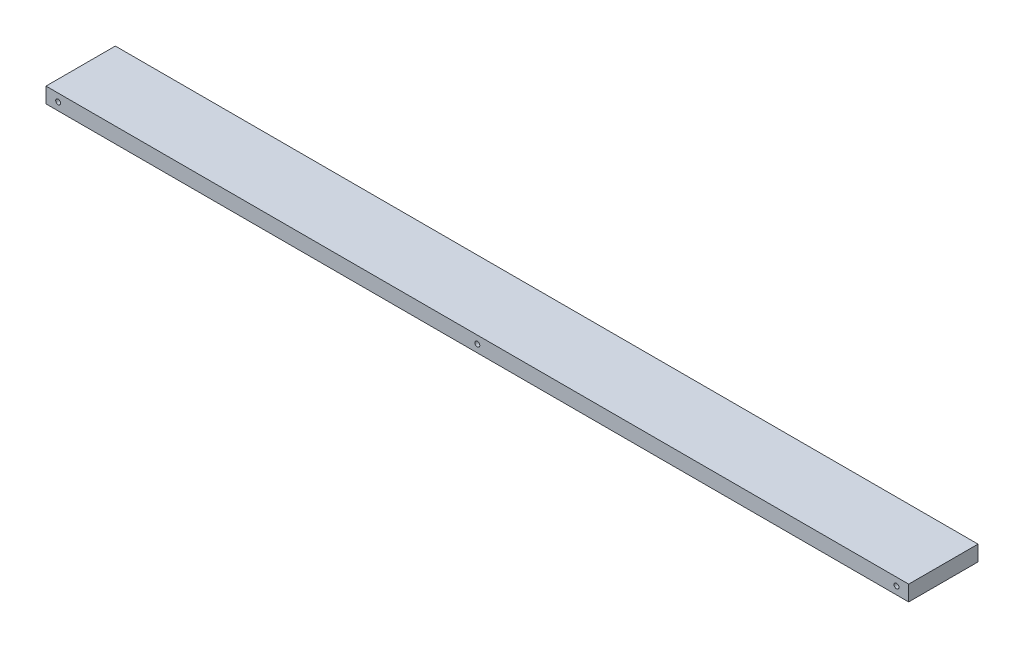
ISO-10303-21;
HEADER;
FILE_DESCRIPTION(('STEP AP214'),'2;1');
FILE_NAME('part.step','',(''),(''),'','','');
FILE_SCHEMA(('AUTOMOTIVE_DESIGN { 1 0 10303 214 1 1 1 1 }'));
ENDSEC;
DATA;
#1=APPLICATION_CONTEXT('core data for automotive mechanical design processes');
#2=APPLICATION_PROTOCOL_DEFINITION('international standard','automotive_design',2000,#1);
#3=PRODUCT_CONTEXT('',#1,'mechanical');
#4=PRODUCT('Part','Part','',(#3));
#5=PRODUCT_RELATED_PRODUCT_CATEGORY('part','',(#4));
#6=PRODUCT_DEFINITION_FORMATION('','',#4);
#7=PRODUCT_DEFINITION_CONTEXT('part definition',#1,'design');
#8=PRODUCT_DEFINITION('design','',#6,#7);
#9=PRODUCT_DEFINITION_SHAPE('','',#8);
#10=(LENGTH_UNIT() NAMED_UNIT(*) SI_UNIT(.MILLI.,.METRE.));
#11=(NAMED_UNIT(*) PLANE_ANGLE_UNIT() SI_UNIT($,.RADIAN.));
#12=(NAMED_UNIT(*) SI_UNIT($,.STERADIAN.) SOLID_ANGLE_UNIT());
#13=UNCERTAINTY_MEASURE_WITH_UNIT(LENGTH_MEASURE(1.E-05),#10,'distance_accuracy_value','');
#14=(GEOMETRIC_REPRESENTATION_CONTEXT(3) GLOBAL_UNCERTAINTY_ASSIGNED_CONTEXT((#13)) GLOBAL_UNIT_ASSIGNED_CONTEXT((#10,
#11,#12)) REPRESENTATION_CONTEXT('',''));
#15=CARTESIAN_POINT('',(0.,0.,0.));
#16=DIRECTION('',(0.,0.,1.));
#17=DIRECTION('',(1.,0.,0.));
#18=AXIS2_PLACEMENT_3D('',#15,#16,#17);
#19=CARTESIAN_POINT('',(0.,12.7,0.));
#20=DIRECTION('',(1.,0.,0.));
#21=DIRECTION('',(0.,0.,-1.));
#22=AXIS2_PLACEMENT_3D('',#19,#20,#21);
#23=PLANE('',#22);
#24=DIRECTION('',(0.,0.,1.));
#25=VECTOR('',#24,1.);
#26=CARTESIAN_POINT('',(0.,0.,0.));
#27=LINE('',#26,#25);
#28=CARTESIAN_POINT('',(0.,0.,-56.98));
#29=VERTEX_POINT('',#28);
#30=CARTESIAN_POINT('',(0.,0.,0.));
#31=VERTEX_POINT('',#30);
#32=EDGE_CURVE('E112',#29,#31,#27,.T.);
#33=ORIENTED_EDGE('',*,*,#32,.T.);
#34=DIRECTION('',(0.,-1.,0.));
#35=VECTOR('',#34,1.);
#36=CARTESIAN_POINT('',(0.,12.7,0.));
#37=LINE('',#36,#35);
#38=CARTESIAN_POINT('',(0.,12.7,0.));
#39=VERTEX_POINT('',#38);
#40=EDGE_CURVE('E11',#39,#31,#37,.T.);
#41=ORIENTED_EDGE('',*,*,#40,.F.);
#42=DIRECTION('',(0.,0.,1.));
#43=VECTOR('',#42,1.);
#44=CARTESIAN_POINT('',(0.,12.7,0.));
#45=LINE('',#44,#43);
#46=CARTESIAN_POINT('',(0.,12.7,-56.98));
#47=VERTEX_POINT('',#46);
#48=EDGE_CURVE('E96',#47,#39,#45,.T.);
#49=ORIENTED_EDGE('',*,*,#48,.F.);
#50=DIRECTION('',(0.,-1.,0.));
#51=VECTOR('',#50,1.);
#52=CARTESIAN_POINT('',(0.,12.7,-56.98));
#53=LINE('',#52,#51);
#54=EDGE_CURVE('E108',#47,#29,#53,.T.);
#55=ORIENTED_EDGE('',*,*,#54,.T.);
#56=EDGE_LOOP('',(#33,#41,#49,#55));
#57=FACE_BOUND('',#56,.T.);
#58=ADVANCED_FACE('F44',(#57),#23,.F.);
#59=CARTESIAN_POINT('',(0.,12.7,0.));
#60=DIRECTION('',(0.,0.,-1.));
#61=DIRECTION('',(-1.,0.,0.));
#62=AXIS2_PLACEMENT_3D('',#59,#60,#61);
#63=PLANE('',#62);
#64=CARTESIAN_POINT('',(699.,6.35,0.));
#65=DIRECTION('',(0.,0.,1.));
#66=DIRECTION('',(1.,0.,0.));
#67=AXIS2_PLACEMENT_3D('',#64,#65,#66);
#68=CIRCLE('',#67,2.01949999999992);
#69=CARTESIAN_POINT('',(701.0195,6.35,0.));
#70=VERTEX_POINT('',#69);
#71=EDGE_CURVE('E149',#70,#70,#68,.T.);
#72=ORIENTED_EDGE('',*,*,#71,.F.);
#73=EDGE_LOOP('',(#72));
#74=FACE_BOUND('',#73,.T.);
#75=CARTESIAN_POINT('',(354.5,6.35,0.));
#76=DIRECTION('',(0.,0.,1.));
#77=DIRECTION('',(1.,0.,0.));
#78=AXIS2_PLACEMENT_3D('',#75,#76,#77);
#79=CIRCLE('',#78,2.01950000000003);
#80=CARTESIAN_POINT('',(356.5195,6.35,0.));
#81=VERTEX_POINT('',#80);
#82=EDGE_CURVE('E145',#81,#81,#79,.T.);
#83=ORIENTED_EDGE('',*,*,#82,.F.);
#84=EDGE_LOOP('',(#83));
#85=FACE_BOUND('',#84,.T.);
#86=CARTESIAN_POINT('',(10.,6.35,0.));
#87=DIRECTION('',(0.,0.,1.));
#88=DIRECTION('',(1.,0.,0.));
#89=AXIS2_PLACEMENT_3D('',#86,#87,#88);
#90=CIRCLE('',#89,2.0195);
#91=CARTESIAN_POINT('',(12.0195,6.35,0.));
#92=VERTEX_POINT('',#91);
#93=EDGE_CURVE('E137',#92,#92,#90,.T.);
#94=ORIENTED_EDGE('',*,*,#93,.F.);
#95=EDGE_LOOP('',(#94));
#96=FACE_BOUND('',#95,.T.);
#97=DIRECTION('',(1.,0.,0.));
#98=VECTOR('',#97,1.);
#99=CARTESIAN_POINT('',(0.,0.,0.));
#100=LINE('',#99,#98);
#101=CARTESIAN_POINT('',(709.,0.,0.));
#102=VERTEX_POINT('',#101);
#103=EDGE_CURVE('E101',#31,#102,#100,.T.);
#104=ORIENTED_EDGE('',*,*,#103,.T.);
#105=DIRECTION('',(0.,-1.,0.));
#106=VECTOR('',#105,1.);
#107=CARTESIAN_POINT('',(709.,12.7,0.));
#108=LINE('',#107,#106);
#109=CARTESIAN_POINT('',(709.,12.7,0.));
#110=VERTEX_POINT('',#109);
#111=EDGE_CURVE('E53',#110,#102,#108,.T.);
#112=ORIENTED_EDGE('',*,*,#111,.F.);
#113=DIRECTION('',(1.,0.,0.));
#114=VECTOR('',#113,1.);
#115=CARTESIAN_POINT('',(0.,12.7,0.));
#116=LINE('',#115,#114);
#117=EDGE_CURVE('E91',#39,#110,#116,.T.);
#118=ORIENTED_EDGE('',*,*,#117,.F.);
#119=ORIENTED_EDGE('',*,*,#40,.T.);
#120=EDGE_LOOP('',(#104,#112,#118,#119));
#121=FACE_BOUND('',#120,.T.);
#122=ADVANCED_FACE('F100',(#74,#85,#96,#121),#63,.F.);
#123=CARTESIAN_POINT('',(709.,12.7,0.));
#124=DIRECTION('',(-1.,0.,0.));
#125=DIRECTION('',(0.,0.,1.));
#126=AXIS2_PLACEMENT_3D('',#123,#124,#125);
#127=PLANE('',#126);
#128=DIRECTION('',(0.,0.,-1.));
#129=VECTOR('',#128,1.);
#130=CARTESIAN_POINT('',(709.,0.,0.));
#131=LINE('',#130,#129);
#132=CARTESIAN_POINT('',(709.,0.,-56.98));
#133=VERTEX_POINT('',#132);
#134=EDGE_CURVE('E78',#102,#133,#131,.T.);
#135=ORIENTED_EDGE('',*,*,#134,.T.);
#136=DIRECTION('',(0.,-1.,0.));
#137=VECTOR('',#136,1.);
#138=CARTESIAN_POINT('',(709.,12.7,-56.98));
#139=LINE('',#138,#137);
#140=CARTESIAN_POINT('',(709.,12.7,-56.98));
#141=VERTEX_POINT('',#140);
#142=EDGE_CURVE('E103',#141,#133,#139,.T.);
#143=ORIENTED_EDGE('',*,*,#142,.F.);
#144=DIRECTION('',(0.,0.,-1.));
#145=VECTOR('',#144,1.);
#146=CARTESIAN_POINT('',(709.,12.7,0.));
#147=LINE('',#146,#145);
#148=EDGE_CURVE('E94',#110,#141,#147,.T.);
#149=ORIENTED_EDGE('',*,*,#148,.F.);
#150=ORIENTED_EDGE('',*,*,#111,.T.);
#151=EDGE_LOOP('',(#135,#143,#149,#150));
#152=FACE_BOUND('',#151,.T.);
#153=ADVANCED_FACE('F104',(#152),#127,.F.);
#154=CARTESIAN_POINT('',(0.,12.7,-56.98));
#155=DIRECTION('',(0.,0.,1.));
#156=DIRECTION('',(1.,0.,0.));
#157=AXIS2_PLACEMENT_3D('',#154,#155,#156);
#158=PLANE('',#157);
#159=DIRECTION('',(-1.,0.,0.));
#160=VECTOR('',#159,1.);
#161=CARTESIAN_POINT('',(0.,0.,-56.98));
#162=LINE('',#161,#160);
#163=EDGE_CURVE('E84',#133,#29,#162,.T.);
#164=ORIENTED_EDGE('',*,*,#163,.T.);
#165=ORIENTED_EDGE('',*,*,#54,.F.);
#166=DIRECTION('',(-1.,0.,0.));
#167=VECTOR('',#166,1.);
#168=CARTESIAN_POINT('',(0.,12.7,-56.98));
#169=LINE('',#168,#167);
#170=EDGE_CURVE('E61',#141,#47,#169,.T.);
#171=ORIENTED_EDGE('',*,*,#170,.F.);
#172=ORIENTED_EDGE('',*,*,#142,.T.);
#173=EDGE_LOOP('',(#164,#165,#171,#172));
#174=FACE_BOUND('',#173,.T.);
#175=ADVANCED_FACE('F126',(#174),#158,.F.);
#176=CARTESIAN_POINT('',(0.,12.7,0.));
#177=DIRECTION('',(0.,-1.,0.));
#178=DIRECTION('',(0.,0.,-1.));
#179=AXIS2_PLACEMENT_3D('',#176,#177,#178);
#180=PLANE('',#179);
#181=ORIENTED_EDGE('',*,*,#48,.T.);
#182=ORIENTED_EDGE('',*,*,#117,.T.);
#183=ORIENTED_EDGE('',*,*,#148,.T.);
#184=ORIENTED_EDGE('',*,*,#170,.T.);
#185=EDGE_LOOP('',(#181,#182,#183,#184));
#186=FACE_BOUND('',#185,.T.);
#187=ADVANCED_FACE('F92',(#186),#180,.F.);
#188=CARTESIAN_POINT('',(0.,0.,0.));
#189=DIRECTION('',(0.,-1.,0.));
#190=DIRECTION('',(0.,0.,-1.));
#191=AXIS2_PLACEMENT_3D('',#188,#189,#190);
#192=PLANE('',#191);
#193=ORIENTED_EDGE('',*,*,#32,.F.);
#194=ORIENTED_EDGE('',*,*,#163,.F.);
#195=ORIENTED_EDGE('',*,*,#134,.F.);
#196=ORIENTED_EDGE('',*,*,#103,.F.);
#197=EDGE_LOOP('',(#193,#194,#195,#196));
#198=FACE_BOUND('',#197,.T.);
#199=ADVANCED_FACE('F129',(#198),#192,.T.);
#200=CARTESIAN_POINT('',(10.,6.35,-12.7));
#201=DIRECTION('',(0.,0.,1.));
#202=DIRECTION('',(1.,0.,0.));
#203=AXIS2_PLACEMENT_3D('',#200,#201,#202);
#204=CYLINDRICAL_SURFACE('',#203,2.0195);
#205=CARTESIAN_POINT('',(10.,6.35,-12.7));
#206=DIRECTION('',(0.,0.,1.));
#207=DIRECTION('',(1.,0.,0.));
#208=AXIS2_PLACEMENT_3D('',#205,#206,#207);
#209=CIRCLE('',#208,2.0195);
#210=CARTESIAN_POINT('',(12.0195,6.35,-12.7));
#211=VERTEX_POINT('',#210);
#212=EDGE_CURVE('E133',#211,#211,#209,.T.);
#213=ORIENTED_EDGE('',*,*,#212,.F.);
#214=EDGE_LOOP('',(#213));
#215=FACE_BOUND('',#214,.T.);
#216=ORIENTED_EDGE('',*,*,#93,.T.);
#217=EDGE_LOOP('',(#216));
#218=FACE_BOUND('',#217,.T.);
#219=ADVANCED_FACE('F172',(#215,#218),#204,.F.);
#220=CARTESIAN_POINT('',(10.,6.35,-12.7));
#221=DIRECTION('',(0.,0.,1.));
#222=DIRECTION('',(1.,0.,0.));
#223=AXIS2_PLACEMENT_3D('',#220,#221,#222);
#224=PLANE('',#223);
#225=ORIENTED_EDGE('',*,*,#212,.T.);
#226=EDGE_LOOP('',(#225));
#227=FACE_BOUND('',#226,.T.);
#228=ADVANCED_FACE('F174',(#227),#224,.T.);
#229=CARTESIAN_POINT('',(354.5,6.35,-12.7));
#230=DIRECTION('',(0.,0.,1.));
#231=DIRECTION('',(1.,0.,0.));
#232=AXIS2_PLACEMENT_3D('',#229,#230,#231);
#233=CYLINDRICAL_SURFACE('',#232,2.01950000000003);
#234=CARTESIAN_POINT('',(354.5,6.35,-12.7));
#235=DIRECTION('',(0.,0.,1.));
#236=DIRECTION('',(1.,0.,0.));
#237=AXIS2_PLACEMENT_3D('',#234,#235,#236);
#238=CIRCLE('',#237,2.01950000000003);
#239=CARTESIAN_POINT('',(356.5195,6.35,-12.7));
#240=VERTEX_POINT('',#239);
#241=EDGE_CURVE('E141',#240,#240,#238,.T.);
#242=ORIENTED_EDGE('',*,*,#241,.F.);
#243=EDGE_LOOP('',(#242));
#244=FACE_BOUND('',#243,.T.);
#245=ORIENTED_EDGE('',*,*,#82,.T.);
#246=EDGE_LOOP('',(#245));
#247=FACE_BOUND('',#246,.T.);
#248=ADVANCED_FACE('F180',(#244,#247),#233,.F.);
#249=CARTESIAN_POINT('',(354.5,6.35,-12.7));
#250=DIRECTION('',(0.,0.,1.));
#251=DIRECTION('',(1.,0.,0.));
#252=AXIS2_PLACEMENT_3D('',#249,#250,#251);
#253=PLANE('',#252);
#254=ORIENTED_EDGE('',*,*,#241,.T.);
#255=EDGE_LOOP('',(#254));
#256=FACE_BOUND('',#255,.T.);
#257=ADVANCED_FACE('F162',(#256),#253,.T.);
#258=CARTESIAN_POINT('',(699.,6.35,-12.7));
#259=DIRECTION('',(0.,0.,1.));
#260=DIRECTION('',(1.,0.,0.));
#261=AXIS2_PLACEMENT_3D('',#258,#259,#260);
#262=CYLINDRICAL_SURFACE('',#261,2.01949999999992);
#263=CARTESIAN_POINT('',(699.,6.35,-12.7));
#264=DIRECTION('',(0.,0.,1.));
#265=DIRECTION('',(1.,0.,0.));
#266=AXIS2_PLACEMENT_3D('',#263,#264,#265);
#267=CIRCLE('',#266,2.01949999999992);
#268=CARTESIAN_POINT('',(701.0195,6.35,-12.7));
#269=VERTEX_POINT('',#268);
#270=EDGE_CURVE('E116',#269,#269,#267,.T.);
#271=ORIENTED_EDGE('',*,*,#270,.F.);
#272=EDGE_LOOP('',(#271));
#273=FACE_BOUND('',#272,.T.);
#274=ORIENTED_EDGE('',*,*,#71,.T.);
#275=EDGE_LOOP('',(#274));
#276=FACE_BOUND('',#275,.T.);
#277=ADVANCED_FACE('F159',(#273,#276),#262,.F.);
#278=CARTESIAN_POINT('',(699.,6.35,-12.7));
#279=DIRECTION('',(0.,0.,1.));
#280=DIRECTION('',(1.,0.,0.));
#281=AXIS2_PLACEMENT_3D('',#278,#279,#280);
#282=PLANE('',#281);
#283=ORIENTED_EDGE('',*,*,#270,.T.);
#284=EDGE_LOOP('',(#283));
#285=FACE_BOUND('',#284,.T.);
#286=ADVANCED_FACE('F157',(#285),#282,.T.);
#287=CLOSED_SHELL('',(#58,#122,#153,#175,#187,#199,#219,#228,#248,#257,#277,#286));
#288=MANIFOLD_SOLID_BREP('B2',#287);
#289=ADVANCED_BREP_SHAPE_REPRESENTATION('',(#18,#288),#14);
#290=SHAPE_DEFINITION_REPRESENTATION(#9,#289);
ENDSEC;
END-ISO-10303-21;
